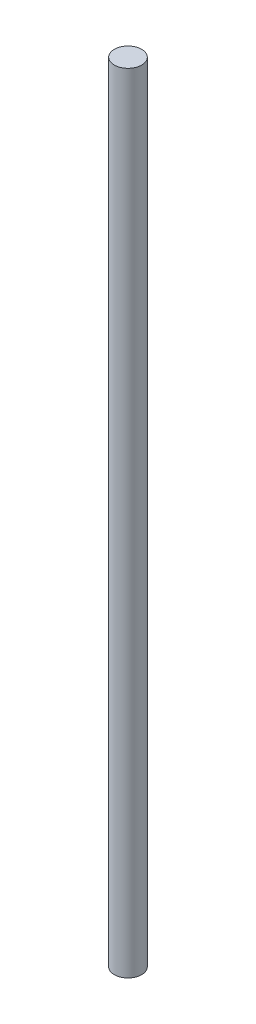
ISO-10303-21;
HEADER;
FILE_DESCRIPTION(('STEP AP214'),'2;1');
FILE_NAME('part.step','',(''),(''),'','','');
FILE_SCHEMA(('AUTOMOTIVE_DESIGN { 1 0 10303 214 1 1 1 1 }'));
ENDSEC;
DATA;
#1=APPLICATION_CONTEXT('core data for automotive mechanical design processes');
#2=APPLICATION_PROTOCOL_DEFINITION('international standard','automotive_design',2000,#1);
#3=PRODUCT_CONTEXT('',#1,'mechanical');
#4=PRODUCT('Part','Part','',(#3));
#5=PRODUCT_RELATED_PRODUCT_CATEGORY('part','',(#4));
#6=PRODUCT_DEFINITION_FORMATION('','',#4);
#7=PRODUCT_DEFINITION_CONTEXT('part definition',#1,'design');
#8=PRODUCT_DEFINITION('design','',#6,#7);
#9=PRODUCT_DEFINITION_SHAPE('','',#8);
#10=(LENGTH_UNIT() NAMED_UNIT(*) SI_UNIT(.MILLI.,.METRE.));
#11=(NAMED_UNIT(*) PLANE_ANGLE_UNIT() SI_UNIT($,.RADIAN.));
#12=(NAMED_UNIT(*) SI_UNIT($,.STERADIAN.) SOLID_ANGLE_UNIT());
#13=UNCERTAINTY_MEASURE_WITH_UNIT(LENGTH_MEASURE(1.E-05),#10,'distance_accuracy_value','');
#14=(GEOMETRIC_REPRESENTATION_CONTEXT(3) GLOBAL_UNCERTAINTY_ASSIGNED_CONTEXT((#13)) GLOBAL_UNIT_ASSIGNED_CONTEXT((#10,
#11,#12)) REPRESENTATION_CONTEXT('',''));
#15=CARTESIAN_POINT('',(0.,0.,0.));
#16=DIRECTION('',(0.,0.,1.));
#17=DIRECTION('',(1.,0.,0.));
#18=AXIS2_PLACEMENT_3D('',#15,#16,#17);
#19=CARTESIAN_POINT('',(0.,914.4,0.));
#20=DIRECTION('',(0.,-1.,0.));
#21=DIRECTION('',(0.,0.,-1.));
#22=AXIS2_PLACEMENT_3D('',#19,#20,#21);
#23=CYLINDRICAL_SURFACE('',#22,15.875);
#24=CARTESIAN_POINT('',(0.,914.4,0.));
#25=DIRECTION('',(0.,1.,0.));
#26=DIRECTION('',(0.,0.,1.));
#27=AXIS2_PLACEMENT_3D('',#24,#25,#26);
#28=CIRCLE('',#27,15.875);
#29=CARTESIAN_POINT('',(0.,914.4,15.875));
#30=VERTEX_POINT('',#29);
#31=EDGE_CURVE('E10',#30,#30,#28,.T.);
#32=ORIENTED_EDGE('',*,*,#31,.F.);
#33=EDGE_LOOP('',(#32));
#34=FACE_BOUND('',#33,.T.);
#35=CARTESIAN_POINT('',(0.,0.,0.));
#36=DIRECTION('',(0.,1.,0.));
#37=DIRECTION('',(0.,0.,1.));
#38=AXIS2_PLACEMENT_3D('',#35,#36,#37);
#39=CIRCLE('',#38,15.875);
#40=CARTESIAN_POINT('',(0.,0.,15.875));
#41=VERTEX_POINT('',#40);
#42=EDGE_CURVE('E36',#41,#41,#39,.T.);
#43=ORIENTED_EDGE('',*,*,#42,.T.);
#44=EDGE_LOOP('',(#43));
#45=FACE_BOUND('',#44,.T.);
#46=ADVANCED_FACE('F33',(#34,#45),#23,.T.);
#47=CARTESIAN_POINT('',(0.,914.4,0.));
#48=DIRECTION('',(0.,1.,0.));
#49=DIRECTION('',(0.,0.,1.));
#50=AXIS2_PLACEMENT_3D('',#47,#48,#49);
#51=PLANE('',#50);
#52=ORIENTED_EDGE('',*,*,#31,.T.);
#53=EDGE_LOOP('',(#52));
#54=FACE_BOUND('',#53,.T.);
#55=ADVANCED_FACE('F48',(#54),#51,.T.);
#56=CARTESIAN_POINT('',(0.,0.,0.));
#57=DIRECTION('',(0.,1.,0.));
#58=DIRECTION('',(0.,0.,1.));
#59=AXIS2_PLACEMENT_3D('',#56,#57,#58);
#60=PLANE('',#59);
#61=ORIENTED_EDGE('',*,*,#42,.F.);
#62=EDGE_LOOP('',(#61));
#63=FACE_BOUND('',#62,.T.);
#64=ADVANCED_FACE('F46',(#63),#60,.F.);
#65=CLOSED_SHELL('',(#46,#55,#64));
#66=MANIFOLD_SOLID_BREP('B2',#65);
#67=ADVANCED_BREP_SHAPE_REPRESENTATION('',(#18,#66),#14);
#68=SHAPE_DEFINITION_REPRESENTATION(#9,#67);
ENDSEC;
END-ISO-10303-21;
